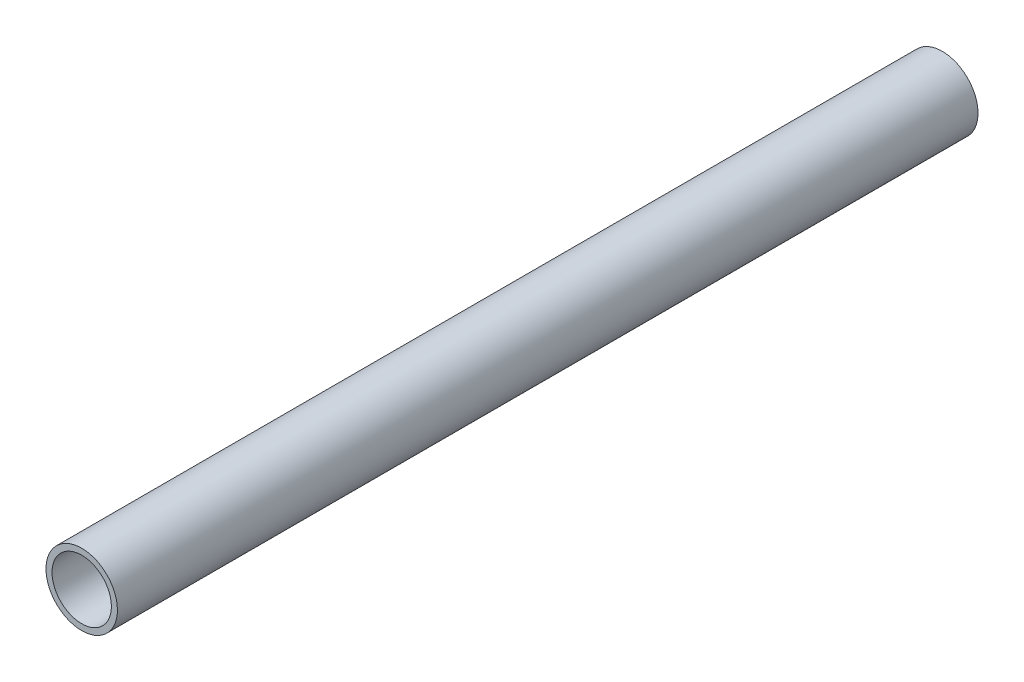
ISO-10303-21;
HEADER;
FILE_DESCRIPTION(('STEP AP214'),'2;1');
FILE_NAME('part.step','',(''),(''),'','','');
FILE_SCHEMA(('AUTOMOTIVE_DESIGN { 1 0 10303 214 1 1 1 1 }'));
ENDSEC;
DATA;
#1=APPLICATION_CONTEXT('core data for automotive mechanical design processes');
#2=APPLICATION_PROTOCOL_DEFINITION('international standard','automotive_design',2000,#1);
#3=PRODUCT_CONTEXT('',#1,'mechanical');
#4=PRODUCT('Part','Part','',(#3));
#5=PRODUCT_RELATED_PRODUCT_CATEGORY('part','',(#4));
#6=PRODUCT_DEFINITION_FORMATION('','',#4);
#7=PRODUCT_DEFINITION_CONTEXT('part definition',#1,'design');
#8=PRODUCT_DEFINITION('design','',#6,#7);
#9=PRODUCT_DEFINITION_SHAPE('','',#8);
#10=(LENGTH_UNIT() NAMED_UNIT(*) SI_UNIT(.MILLI.,.METRE.));
#11=(NAMED_UNIT(*) PLANE_ANGLE_UNIT() SI_UNIT($,.RADIAN.));
#12=(NAMED_UNIT(*) SI_UNIT($,.STERADIAN.) SOLID_ANGLE_UNIT());
#13=UNCERTAINTY_MEASURE_WITH_UNIT(LENGTH_MEASURE(1.E-05),#10,'distance_accuracy_value','');
#14=(GEOMETRIC_REPRESENTATION_CONTEXT(3) GLOBAL_UNCERTAINTY_ASSIGNED_CONTEXT((#13)) GLOBAL_UNIT_ASSIGNED_CONTEXT((#10,
#11,#12)) REPRESENTATION_CONTEXT('',''));
#15=CARTESIAN_POINT('',(0.,0.,0.));
#16=DIRECTION('',(0.,0.,1.));
#17=DIRECTION('',(1.,0.,0.));
#18=AXIS2_PLACEMENT_3D('',#15,#16,#17);
#19=CARTESIAN_POINT('',(0.,0.,0.));
#20=DIRECTION('',(0.,0.,1.));
#21=DIRECTION('',(1.,0.,0.));
#22=AXIS2_PLACEMENT_3D('',#19,#20,#21);
#23=CYLINDRICAL_SURFACE('',#22,17.526);
#24=CARTESIAN_POINT('',(0.,0.,508.));
#25=DIRECTION('',(0.,0.,1.));
#26=DIRECTION('',(1.,0.,0.));
#27=AXIS2_PLACEMENT_3D('',#24,#25,#26);
#28=CIRCLE('',#27,17.526);
#29=CARTESIAN_POINT('',(17.526,0.,508.));
#30=VERTEX_POINT('',#29);
#31=EDGE_CURVE('E9',#30,#30,#28,.T.);
#32=ORIENTED_EDGE('',*,*,#31,.T.);
#33=EDGE_LOOP('',(#32));
#34=FACE_BOUND('',#33,.T.);
#35=CARTESIAN_POINT('',(0.,0.,0.));
#36=DIRECTION('',(0.,0.,1.));
#37=DIRECTION('',(1.,0.,0.));
#38=AXIS2_PLACEMENT_3D('',#35,#36,#37);
#39=CIRCLE('',#38,17.526);
#40=CARTESIAN_POINT('',(17.526,0.,0.));
#41=VERTEX_POINT('',#40);
#42=EDGE_CURVE('E28',#41,#41,#39,.T.);
#43=ORIENTED_EDGE('',*,*,#42,.F.);
#44=EDGE_LOOP('',(#43));
#45=FACE_BOUND('',#44,.T.);
#46=ADVANCED_FACE('F14',(#34,#45),#23,.F.);
#47=CARTESIAN_POINT('',(0.,0.,0.));
#48=DIRECTION('',(0.,0.,1.));
#49=DIRECTION('',(1.,0.,0.));
#50=AXIS2_PLACEMENT_3D('',#47,#48,#49);
#51=CYLINDRICAL_SURFACE('',#50,21.082);
#52=CARTESIAN_POINT('',(0.,0.,508.));
#53=DIRECTION('',(0.,0.,-1.));
#54=DIRECTION('',(0.,-1.,0.));
#55=AXIS2_PLACEMENT_3D('',#52,#53,#54);
#56=CIRCLE('',#55,21.082);
#57=CARTESIAN_POINT('',(0.,-21.082,508.));
#58=VERTEX_POINT('',#57);
#59=EDGE_CURVE('E22',#58,#58,#56,.T.);
#60=ORIENTED_EDGE('',*,*,#59,.T.);
#61=EDGE_LOOP('',(#60));
#62=FACE_BOUND('',#61,.T.);
#63=CARTESIAN_POINT('',(0.,0.,0.));
#64=DIRECTION('',(0.,0.,-1.));
#65=DIRECTION('',(0.,-1.,0.));
#66=AXIS2_PLACEMENT_3D('',#63,#64,#65);
#67=CIRCLE('',#66,21.082);
#68=CARTESIAN_POINT('',(0.,-21.082,0.));
#69=VERTEX_POINT('',#68);
#70=EDGE_CURVE('E18',#69,#69,#67,.T.);
#71=ORIENTED_EDGE('',*,*,#70,.F.);
#72=EDGE_LOOP('',(#71));
#73=FACE_BOUND('',#72,.T.);
#74=ADVANCED_FACE('F16',(#62,#73),#51,.T.);
#75=CARTESIAN_POINT('',(0.,0.,0.));
#76=DIRECTION('',(0.,0.,1.));
#77=DIRECTION('',(1.,0.,0.));
#78=AXIS2_PLACEMENT_3D('',#75,#76,#77);
#79=PLANE('',#78);
#80=ORIENTED_EDGE('',*,*,#70,.T.);
#81=EDGE_LOOP('',(#80));
#82=FACE_BOUND('',#81,.T.);
#83=ORIENTED_EDGE('',*,*,#42,.T.);
#84=EDGE_LOOP('',(#83));
#85=FACE_BOUND('',#84,.T.);
#86=ADVANCED_FACE('F35',(#82,#85),#79,.F.);
#87=CARTESIAN_POINT('',(0.,0.,508.));
#88=DIRECTION('',(0.,0.,1.));
#89=DIRECTION('',(1.,0.,0.));
#90=AXIS2_PLACEMENT_3D('',#87,#88,#89);
#91=PLANE('',#90);
#92=ORIENTED_EDGE('',*,*,#59,.F.);
#93=EDGE_LOOP('',(#92));
#94=FACE_BOUND('',#93,.T.);
#95=ORIENTED_EDGE('',*,*,#31,.F.);
#96=EDGE_LOOP('',(#95));
#97=FACE_BOUND('',#96,.T.);
#98=ADVANCED_FACE('F44',(#94,#97),#91,.T.);
#99=CLOSED_SHELL('',(#46,#74,#86,#98));
#100=MANIFOLD_SOLID_BREP('B1',#99);
#101=ADVANCED_BREP_SHAPE_REPRESENTATION('',(#18,#100),#14);
#102=SHAPE_DEFINITION_REPRESENTATION(#9,#101);
ENDSEC;
END-ISO-10303-21;
